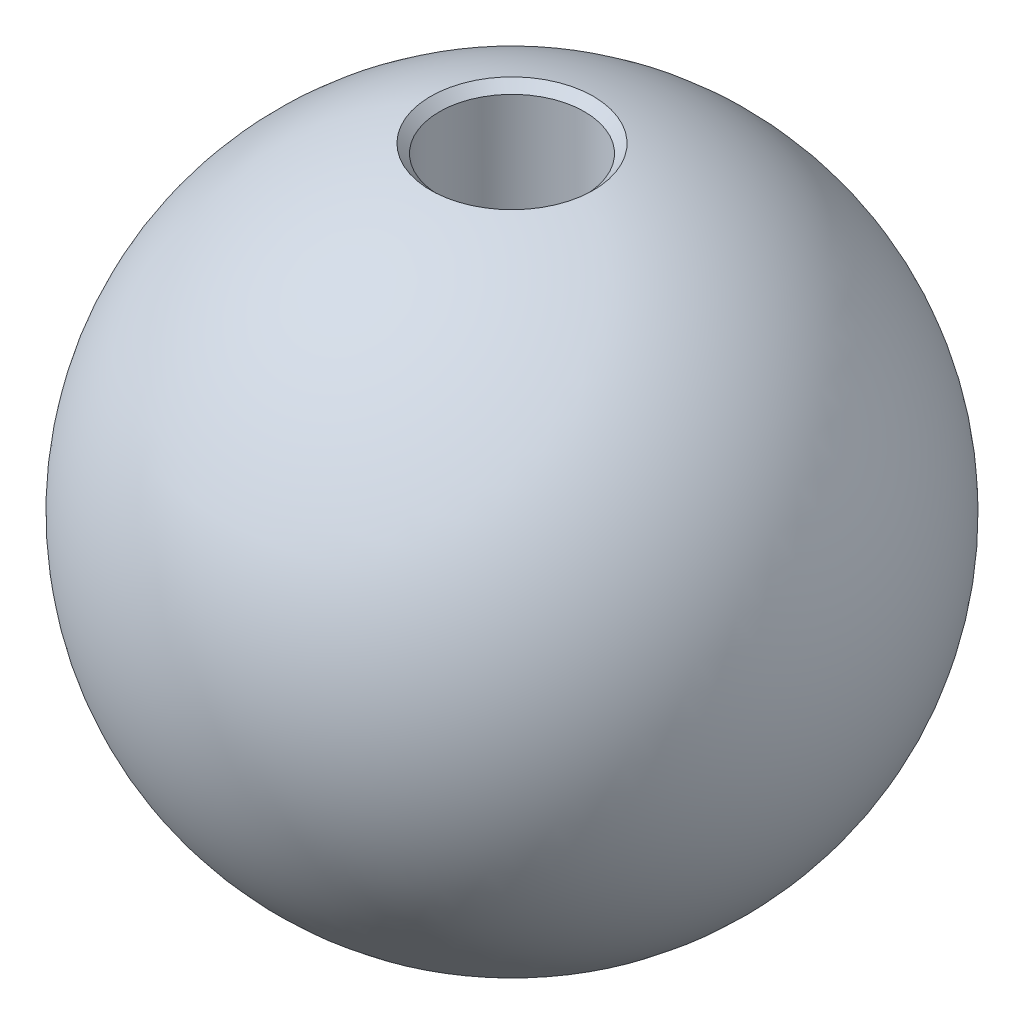
ISO-10303-21;
HEADER;
FILE_DESCRIPTION(('STEP AP214'),'2;1');
FILE_NAME('part.step','',(''),(''),'','','');
FILE_SCHEMA(('AUTOMOTIVE_DESIGN { 1 0 10303 214 1 1 1 1 }'));
ENDSEC;
DATA;
#1=APPLICATION_CONTEXT('core data for automotive mechanical design processes');
#2=APPLICATION_PROTOCOL_DEFINITION('international standard','automotive_design',2000,#1);
#3=PRODUCT_CONTEXT('',#1,'mechanical');
#4=PRODUCT('Part','Part','',(#3));
#5=PRODUCT_RELATED_PRODUCT_CATEGORY('part','',(#4));
#6=PRODUCT_DEFINITION_FORMATION('','',#4);
#7=PRODUCT_DEFINITION_CONTEXT('part definition',#1,'design');
#8=PRODUCT_DEFINITION('design','',#6,#7);
#9=PRODUCT_DEFINITION_SHAPE('','',#8);
#10=(LENGTH_UNIT() NAMED_UNIT(*) SI_UNIT(.MILLI.,.METRE.));
#11=(NAMED_UNIT(*) PLANE_ANGLE_UNIT() SI_UNIT($,.RADIAN.));
#12=(NAMED_UNIT(*) SI_UNIT($,.STERADIAN.) SOLID_ANGLE_UNIT());
#13=UNCERTAINTY_MEASURE_WITH_UNIT(LENGTH_MEASURE(1.E-05),#10,'distance_accuracy_value','');
#14=(GEOMETRIC_REPRESENTATION_CONTEXT(3) GLOBAL_UNCERTAINTY_ASSIGNED_CONTEXT((#13)) GLOBAL_UNIT_ASSIGNED_CONTEXT((#10,
#11,#12)) REPRESENTATION_CONTEXT('',''));
#15=CARTESIAN_POINT('',(0.,0.,0.));
#16=DIRECTION('',(0.,0.,1.));
#17=DIRECTION('',(1.,0.,0.));
#18=AXIS2_PLACEMENT_3D('',#15,#16,#17);
#19=CARTESIAN_POINT('',(0.,0.,0.));
#20=DIRECTION('',(-1.,0.,0.));
#21=DIRECTION('',(0.,1.,0.));
#22=AXIS2_PLACEMENT_3D('',#19,#20,#21);
#23=SPHERICAL_SURFACE('',#22,7.5);
#24=CARTESIAN_POINT('',(0.,0.,0.));
#25=DIRECTION('',(0.,-1.,0.));
#26=DIRECTION('',(0.,0.,-1.));
#27=AXIS2_PLACEMENT_3D('',#24,#25,#26);
#28=SPHERICAL_SURFACE('',#27,7.5);
#29=CARTESIAN_POINT('',(0.,7.26784617622405,0.));
#30=DIRECTION('',(0.,-1.,0.));
#31=DIRECTION('',(0.,0.,-1.));
#32=AXIS2_PLACEMENT_3D('',#29,#30,#31);
#33=CIRCLE('',#32,1.85159713726973);
#34=CARTESIAN_POINT('',(0.,7.26784617622405,-1.85159713726973));
#35=VERTEX_POINT('',#34);
#36=EDGE_CURVE('E47',#35,#35,#33,.T.);
#37=ORIENTED_EDGE('',*,*,#36,.T.);
#38=EDGE_LOOP('',(#37));
#39=FACE_BOUND('',#38,.T.);
#40=ADVANCED_FACE('F39',(#39),#28,.T.);
#41=CARTESIAN_POINT('',(0.,7.5,0.));
#42=DIRECTION('',(0.,1.,0.));
#43=DIRECTION('',(0.,0.,1.));
#44=AXIS2_PLACEMENT_3D('',#41,#42,#43);
#45=CYLINDRICAL_SURFACE('',#44,1.65);
#46=CARTESIAN_POINT('',(0.,7.06624903895432,0.));
#47=DIRECTION('',(0.,-1.,0.));
#48=DIRECTION('',(0.,0.,-1.));
#49=AXIS2_PLACEMENT_3D('',#46,#47,#48);
#50=CIRCLE('',#49,1.65);
#51=CARTESIAN_POINT('',(0.,7.06624903895432,-1.65));
#52=VERTEX_POINT('',#51);
#53=EDGE_CURVE('E11',#52,#52,#50,.F.);
#54=ORIENTED_EDGE('',*,*,#53,.T.);
#55=EDGE_LOOP('',(#54));
#56=FACE_BOUND('',#55,.T.);
#57=CARTESIAN_POINT('',(0.,1.5,0.));
#58=DIRECTION('',(0.,1.,0.));
#59=DIRECTION('',(0.,0.,1.));
#60=AXIS2_PLACEMENT_3D('',#57,#58,#59);
#61=CIRCLE('',#60,1.65);
#62=CARTESIAN_POINT('',(0.,1.5,1.65));
#63=VERTEX_POINT('',#62);
#64=EDGE_CURVE('E57',#63,#63,#61,.T.);
#65=ORIENTED_EDGE('',*,*,#64,.F.);
#66=EDGE_LOOP('',(#65));
#67=FACE_BOUND('',#66,.T.);
#68=ADVANCED_FACE('F53',(#56,#67),#45,.F.);
#69=CARTESIAN_POINT('',(0.,1.5,0.));
#70=DIRECTION('',(0.,1.,0.));
#71=DIRECTION('',(0.,0.,1.));
#72=AXIS2_PLACEMENT_3D('',#69,#70,#71);
#73=CONICAL_SURFACE('',#72,1.65,1.02974425867665);
#74=CARTESIAN_POINT('',(0.,0.508579978604524,0.));
#75=VERTEX_POINT('',#74);
#76=VERTEX_LOOP('',#75);
#77=FACE_BOUND('',#76,.T.);
#78=ORIENTED_EDGE('',*,*,#64,.T.);
#79=EDGE_LOOP('',(#78));
#80=FACE_BOUND('',#79,.T.);
#81=ADVANCED_FACE('F50',(#77,#80),#73,.F.);
#82=CARTESIAN_POINT('',(0.,7.26784617622405,0.));
#83=DIRECTION('',(0.,1.,0.));
#84=DIRECTION('',(0.,0.,1.));
#85=AXIS2_PLACEMENT_3D('',#82,#83,#84);
#86=CONICAL_SURFACE('',#85,1.85159713726973,0.785398163397445);
#87=ORIENTED_EDGE('',*,*,#53,.F.);
#88=EDGE_LOOP('',(#87));
#89=FACE_BOUND('',#88,.T.);
#90=ORIENTED_EDGE('',*,*,#36,.F.);
#91=EDGE_LOOP('',(#90));
#92=FACE_BOUND('',#91,.T.);
#93=ADVANCED_FACE('F42',(#89,#92),#86,.F.);
#94=CLOSED_SHELL('',(#40,#68,#81,#93));
#95=MANIFOLD_SOLID_BREP('B2',#94);
#96=ADVANCED_BREP_SHAPE_REPRESENTATION('',(#18,#95),#14);
#97=SHAPE_DEFINITION_REPRESENTATION(#9,#96);
ENDSEC;
END-ISO-10303-21;
